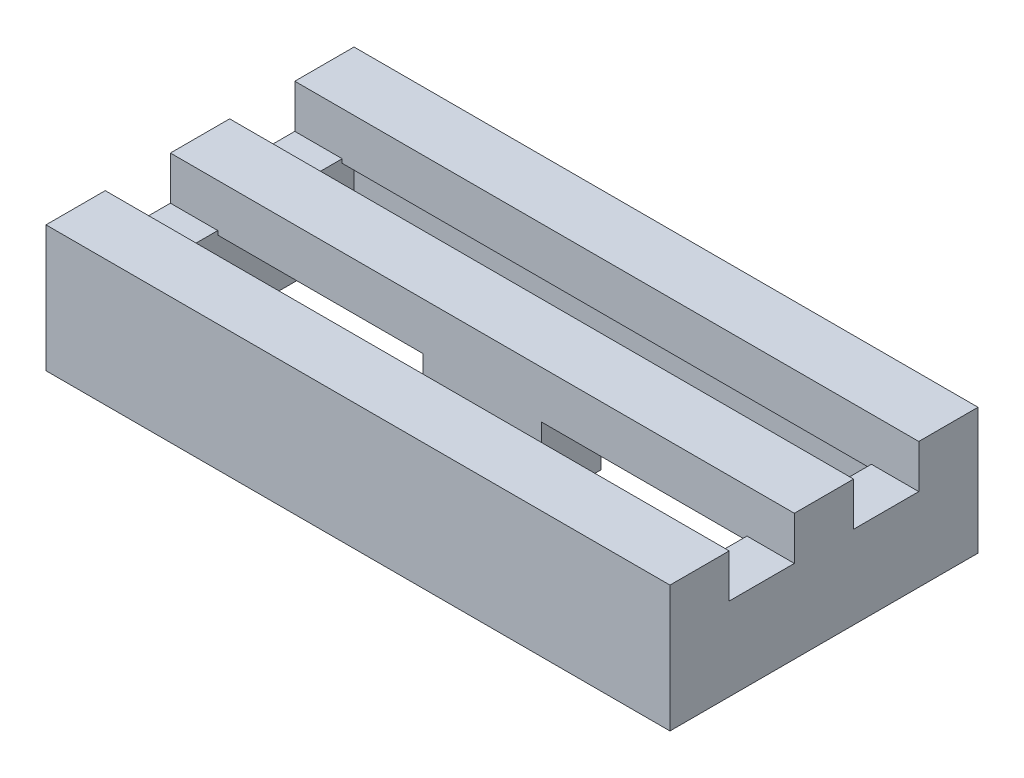
ISO-10303-21;
HEADER;
FILE_DESCRIPTION(('STEP AP214'),'2;1');
FILE_NAME('part.step','',(''),(''),'','','');
FILE_SCHEMA(('AUTOMOTIVE_DESIGN { 1 0 10303 214 1 1 1 1 }'));
ENDSEC;
DATA;
#1=APPLICATION_CONTEXT('core data for automotive mechanical design processes');
#2=APPLICATION_PROTOCOL_DEFINITION('international standard','automotive_design',2000,#1);
#3=PRODUCT_CONTEXT('',#1,'mechanical');
#4=PRODUCT('Part','Part','',(#3));
#5=PRODUCT_RELATED_PRODUCT_CATEGORY('part','',(#4));
#6=PRODUCT_DEFINITION_FORMATION('','',#4);
#7=PRODUCT_DEFINITION_CONTEXT('part definition',#1,'design');
#8=PRODUCT_DEFINITION('design','',#6,#7);
#9=PRODUCT_DEFINITION_SHAPE('','',#8);
#10=(LENGTH_UNIT() NAMED_UNIT(*) SI_UNIT(.MILLI.,.METRE.));
#11=(NAMED_UNIT(*) PLANE_ANGLE_UNIT() SI_UNIT($,.RADIAN.));
#12=(NAMED_UNIT(*) SI_UNIT($,.STERADIAN.) SOLID_ANGLE_UNIT());
#13=UNCERTAINTY_MEASURE_WITH_UNIT(LENGTH_MEASURE(1.E-05),#10,'distance_accuracy_value','');
#14=(GEOMETRIC_REPRESENTATION_CONTEXT(3) GLOBAL_UNCERTAINTY_ASSIGNED_CONTEXT((#13)) GLOBAL_UNIT_ASSIGNED_CONTEXT((#10,
#11,#12)) REPRESENTATION_CONTEXT('',''));
#15=CARTESIAN_POINT('',(0.,0.,0.));
#16=DIRECTION('',(0.,0.,1.));
#17=DIRECTION('',(1.,0.,0.));
#18=AXIS2_PLACEMENT_3D('',#15,#16,#17);
#19=CARTESIAN_POINT('',(0.,2.,-7.8));
#20=DIRECTION('',(0.,1.,0.));
#21=DIRECTION('',(0.,0.,1.));
#22=AXIS2_PLACEMENT_3D('',#19,#20,#21);
#23=PLANE('',#22);
#24=DIRECTION('',(0.,0.,1.));
#25=VECTOR('',#24,1.);
#26=CARTESIAN_POINT('',(9.4,2.,-4.65));
#27=LINE('',#26,#25);
#28=CARTESIAN_POINT('',(9.4,2.,-4.65));
#29=VERTEX_POINT('',#28);
#30=CARTESIAN_POINT('',(9.4,2.,-3.15));
#31=VERTEX_POINT('',#30);
#32=EDGE_CURVE('E54',#29,#31,#27,.T.);
#33=ORIENTED_EDGE('',*,*,#32,.F.);
#34=DIRECTION('',(1.,0.,0.));
#35=VECTOR('',#34,1.);
#36=CARTESIAN_POINT('',(0.,2.,-4.65));
#37=LINE('',#36,#35);
#38=CARTESIAN_POINT('',(14.6,2.,-4.65));
#39=VERTEX_POINT('',#38);
#40=EDGE_CURVE('E296',#29,#39,#37,.T.);
#41=ORIENTED_EDGE('',*,*,#40,.T.);
#42=DIRECTION('',(0.,0.,1.));
#43=VECTOR('',#42,1.);
#44=CARTESIAN_POINT('',(14.6,2.,-7.8));
#45=LINE('',#44,#43);
#46=CARTESIAN_POINT('',(14.6,2.,-3.15));
#47=VERTEX_POINT('',#46);
#48=EDGE_CURVE('E373',#39,#47,#45,.T.);
#49=ORIENTED_EDGE('',*,*,#48,.T.);
#50=DIRECTION('',(-1.,0.,0.));
#51=VECTOR('',#50,1.);
#52=CARTESIAN_POINT('',(0.,2.,-3.15));
#53=LINE('',#52,#51);
#54=EDGE_CURVE('E274',#47,#31,#53,.T.);
#55=ORIENTED_EDGE('',*,*,#54,.T.);
#56=EDGE_LOOP('',(#33,#41,#49,#55));
#57=FACE_BOUND('',#56,.T.);
#58=ADVANCED_FACE('F36',(#57),#23,.F.);
#59=DIRECTION('',(0.,0.,-1.));
#60=VECTOR('',#59,1.);
#61=CARTESIAN_POINT('',(6.4,2.,-3.15));
#62=LINE('',#61,#60);
#63=CARTESIAN_POINT('',(6.4,2.,-3.15));
#64=VERTEX_POINT('',#63);
#65=CARTESIAN_POINT('',(6.4,2.,-4.65));
#66=VERTEX_POINT('',#65);
#67=EDGE_CURVE('E231',#64,#66,#62,.T.);
#68=ORIENTED_EDGE('',*,*,#67,.F.);
#69=CARTESIAN_POINT('',(1.2,2.,-3.15));
#70=VERTEX_POINT('',#69);
#71=EDGE_CURVE('E268',#64,#70,#53,.T.);
#72=ORIENTED_EDGE('',*,*,#71,.T.);
#73=DIRECTION('',(0.,0.,1.));
#74=VECTOR('',#73,1.);
#75=CARTESIAN_POINT('',(1.2,2.,-7.8));
#76=LINE('',#75,#74);
#77=CARTESIAN_POINT('',(1.2,2.,-4.65));
#78=VERTEX_POINT('',#77);
#79=EDGE_CURVE('E360',#78,#70,#76,.T.);
#80=ORIENTED_EDGE('',*,*,#79,.F.);
#81=EDGE_CURVE('E62',#78,#66,#37,.T.);
#82=ORIENTED_EDGE('',*,*,#81,.T.);
#83=EDGE_LOOP('',(#68,#72,#80,#82));
#84=FACE_BOUND('',#83,.T.);
#85=ADVANCED_FACE('F488',(#84),#23,.F.);
#86=CARTESIAN_POINT('',(1.2,2.,-1.5));
#87=VERTEX_POINT('',#86);
#88=CARTESIAN_POINT('',(1.2,2.,-1.2));
#89=VERTEX_POINT('',#88);
#90=EDGE_CURVE('E361',#87,#89,#76,.T.);
#91=ORIENTED_EDGE('',*,*,#90,.F.);
#92=DIRECTION('',(1.,0.,0.));
#93=VECTOR('',#92,1.);
#94=CARTESIAN_POINT('',(0.,2.,-1.5));
#95=LINE('',#94,#93);
#96=CARTESIAN_POINT('',(14.6,2.,-1.5));
#97=VERTEX_POINT('',#96);
#98=EDGE_CURVE('E276',#87,#97,#95,.T.);
#99=ORIENTED_EDGE('',*,*,#98,.T.);
#100=CARTESIAN_POINT('',(14.6,2.,-1.2));
#101=VERTEX_POINT('',#100);
#102=EDGE_CURVE('E374',#97,#101,#45,.T.);
#103=ORIENTED_EDGE('',*,*,#102,.T.);
#104=DIRECTION('',(-1.,0.,0.));
#105=VECTOR('',#104,1.);
#106=CARTESIAN_POINT('',(0.,2.,-1.2));
#107=LINE('',#106,#105);
#108=EDGE_CURVE('E366',#101,#89,#107,.T.);
#109=ORIENTED_EDGE('',*,*,#108,.T.);
#110=EDGE_LOOP('',(#91,#99,#103,#109));
#111=FACE_BOUND('',#110,.T.);
#112=ADVANCED_FACE('F490',(#111),#23,.F.);
#113=CARTESIAN_POINT('',(0.,2.1,3.15));
#114=DIRECTION('',(0.,1.,0.));
#115=DIRECTION('',(0.,0.,1.));
#116=AXIS2_PLACEMENT_3D('',#113,#114,#115);
#117=PLANE('',#116);
#118=DIRECTION('',(0.,0.,1.));
#119=VECTOR('',#118,1.);
#120=CARTESIAN_POINT('',(1.2,2.1,-1.5));
#121=LINE('',#120,#119);
#122=CARTESIAN_POINT('',(1.2,2.1,-3.15));
#123=VERTEX_POINT('',#122);
#124=CARTESIAN_POINT('',(1.2,2.1,-1.5));
#125=VERTEX_POINT('',#124);
#126=EDGE_CURVE('E250',#123,#125,#121,.T.);
#127=ORIENTED_EDGE('',*,*,#126,.F.);
#128=DIRECTION('',(-1.,0.,0.));
#129=VECTOR('',#128,1.);
#130=CARTESIAN_POINT('',(0.,2.1,-3.15));
#131=LINE('',#130,#129);
#132=CARTESIAN_POINT('',(0.,2.1,-3.15));
#133=VERTEX_POINT('',#132);
#134=EDGE_CURVE('E309',#123,#133,#131,.T.);
#135=ORIENTED_EDGE('',*,*,#134,.T.);
#136=DIRECTION('',(0.,0.,1.));
#137=VECTOR('',#136,1.);
#138=CARTESIAN_POINT('',(0.,2.1,-3.15));
#139=LINE('',#138,#137);
#140=CARTESIAN_POINT('',(0.,2.1,-1.5));
#141=VERTEX_POINT('',#140);
#142=EDGE_CURVE('E299',#133,#141,#139,.T.);
#143=ORIENTED_EDGE('',*,*,#142,.T.);
#144=DIRECTION('',(1.,0.,0.));
#145=VECTOR('',#144,1.);
#146=CARTESIAN_POINT('',(0.,2.1,-1.5));
#147=LINE('',#146,#145);
#148=EDGE_CURVE('E304',#141,#125,#147,.T.);
#149=ORIENTED_EDGE('',*,*,#148,.T.);
#150=EDGE_LOOP('',(#127,#135,#143,#149));
#151=FACE_BOUND('',#150,.T.);
#152=ADVANCED_FACE('F483',(#151),#117,.T.);
#153=CARTESIAN_POINT('',(0.,2.1,0.));
#154=DIRECTION('',(0.,1.,0.));
#155=DIRECTION('',(0.,0.,1.));
#156=AXIS2_PLACEMENT_3D('',#153,#154,#155);
#157=PLANE('',#156);
#158=DIRECTION('',(0.,0.,1.));
#159=VECTOR('',#158,1.);
#160=CARTESIAN_POINT('',(1.2,2.1,-4.65));
#161=LINE('',#160,#159);
#162=CARTESIAN_POINT('',(1.2,2.1,-6.3));
#163=VERTEX_POINT('',#162);
#164=CARTESIAN_POINT('',(1.2,2.1,-4.65));
#165=VERTEX_POINT('',#164);
#166=EDGE_CURVE('E282',#163,#165,#161,.T.);
#167=ORIENTED_EDGE('',*,*,#166,.F.);
#168=DIRECTION('',(-1.,0.,0.));
#169=VECTOR('',#168,1.);
#170=CARTESIAN_POINT('',(0.,2.1,-6.3));
#171=LINE('',#170,#169);
#172=CARTESIAN_POINT('',(0.,2.1,-6.3));
#173=VERTEX_POINT('',#172);
#174=EDGE_CURVE('E336',#163,#173,#171,.T.);
#175=ORIENTED_EDGE('',*,*,#174,.T.);
#176=DIRECTION('',(0.,0.,1.));
#177=VECTOR('',#176,1.);
#178=CARTESIAN_POINT('',(0.,2.1,-6.3));
#179=LINE('',#178,#177);
#180=CARTESIAN_POINT('',(0.,2.1,-4.65));
#181=VERTEX_POINT('',#180);
#182=EDGE_CURVE('E326',#173,#181,#179,.T.);
#183=ORIENTED_EDGE('',*,*,#182,.T.);
#184=DIRECTION('',(1.,0.,0.));
#185=VECTOR('',#184,1.);
#186=CARTESIAN_POINT('',(0.,2.1,-4.65));
#187=LINE('',#186,#185);
#188=EDGE_CURVE('E331',#181,#165,#187,.T.);
#189=ORIENTED_EDGE('',*,*,#188,.T.);
#190=EDGE_LOOP('',(#167,#175,#183,#189));
#191=FACE_BOUND('',#190,.T.);
#192=ADVANCED_FACE('F465',(#191),#157,.T.);
#193=CARTESIAN_POINT('',(0.,3.2,-7.8));
#194=DIRECTION('',(0.,1.,0.));
#195=DIRECTION('',(0.,0.,1.));
#196=AXIS2_PLACEMENT_3D('',#193,#194,#195);
#197=PLANE('',#196);
#198=DIRECTION('',(-1.,0.,0.));
#199=VECTOR('',#198,1.);
#200=CARTESIAN_POINT('',(0.,3.2,-3.15));
#201=LINE('',#200,#199);
#202=CARTESIAN_POINT('',(15.8,3.2,-3.15));
#203=VERTEX_POINT('',#202);
#204=CARTESIAN_POINT('',(0.,3.2,-3.15));
#205=VERTEX_POINT('',#204);
#206=EDGE_CURVE('E303',#203,#205,#201,.T.);
#207=ORIENTED_EDGE('',*,*,#206,.F.);
#208=DIRECTION('',(0.,0.,1.));
#209=VECTOR('',#208,1.);
#210=CARTESIAN_POINT('',(15.8,3.2,-7.8));
#211=LINE('',#210,#209);
#212=CARTESIAN_POINT('',(15.8,3.2,-4.65));
#213=VERTEX_POINT('',#212);
#214=EDGE_CURVE('E415',#213,#203,#211,.T.);
#215=ORIENTED_EDGE('',*,*,#214,.F.);
#216=DIRECTION('',(1.,0.,0.));
#217=VECTOR('',#216,1.);
#218=CARTESIAN_POINT('',(0.,3.2,-4.65));
#219=LINE('',#218,#217);
#220=CARTESIAN_POINT('',(0.,3.2,-4.65));
#221=VERTEX_POINT('',#220);
#222=EDGE_CURVE('E319',#221,#213,#219,.T.);
#223=ORIENTED_EDGE('',*,*,#222,.F.);
#224=DIRECTION('',(0.,0.,1.));
#225=VECTOR('',#224,1.);
#226=CARTESIAN_POINT('',(0.,3.2,-7.8));
#227=LINE('',#226,#225);
#228=EDGE_CURVE('E45',#221,#205,#227,.T.);
#229=ORIENTED_EDGE('',*,*,#228,.T.);
#230=EDGE_LOOP('',(#207,#215,#223,#229));
#231=FACE_BOUND('',#230,.T.);
#232=ADVANCED_FACE('F441',(#231),#197,.T.);
#233=DIRECTION('',(-1.,0.,0.));
#234=VECTOR('',#233,1.);
#235=CARTESIAN_POINT('',(0.,3.2,-6.3));
#236=LINE('',#235,#234);
#237=CARTESIAN_POINT('',(15.8,3.2,-6.3));
#238=VERTEX_POINT('',#237);
#239=CARTESIAN_POINT('',(0.,3.2,-6.3));
#240=VERTEX_POINT('',#239);
#241=EDGE_CURVE('E330',#238,#240,#236,.T.);
#242=ORIENTED_EDGE('',*,*,#241,.F.);
#243=CARTESIAN_POINT('',(15.8,3.2,-7.8));
#244=VERTEX_POINT('',#243);
#245=EDGE_CURVE('E413',#244,#238,#211,.T.);
#246=ORIENTED_EDGE('',*,*,#245,.F.);
#247=DIRECTION('',(-1.,0.,0.));
#248=VECTOR('',#247,1.);
#249=CARTESIAN_POINT('',(0.,3.2,-7.8));
#250=LINE('',#249,#248);
#251=CARTESIAN_POINT('',(0.,3.2,-7.8));
#252=VERTEX_POINT('',#251);
#253=EDGE_CURVE('E400',#244,#252,#250,.T.);
#254=ORIENTED_EDGE('',*,*,#253,.T.);
#255=EDGE_CURVE('E12',#252,#240,#227,.T.);
#256=ORIENTED_EDGE('',*,*,#255,.T.);
#257=EDGE_LOOP('',(#242,#246,#254,#256));
#258=FACE_BOUND('',#257,.T.);
#259=ADVANCED_FACE('F471',(#258),#197,.T.);
#260=CARTESIAN_POINT('',(0.,0.,-7.8));
#261=DIRECTION('',(0.,-1.,0.));
#262=DIRECTION('',(0.,0.,-1.));
#263=AXIS2_PLACEMENT_3D('',#260,#261,#262);
#264=PLANE('',#263);
#265=DIRECTION('',(1.,0.,0.));
#266=VECTOR('',#265,1.);
#267=CARTESIAN_POINT('',(0.,0.,0.));
#268=LINE('',#267,#266);
#269=CARTESIAN_POINT('',(0.,0.,0.));
#270=VERTEX_POINT('',#269);
#271=CARTESIAN_POINT('',(15.8,0.,0.));
#272=VERTEX_POINT('',#271);
#273=EDGE_CURVE('E405',#270,#272,#268,.T.);
#274=ORIENTED_EDGE('',*,*,#273,.F.);
#275=DIRECTION('',(0.,0.,1.));
#276=VECTOR('',#275,1.);
#277=CARTESIAN_POINT('',(0.,0.,-7.8));
#278=LINE('',#277,#276);
#279=CARTESIAN_POINT('',(0.,0.,-7.8));
#280=VERTEX_POINT('',#279);
#281=EDGE_CURVE('E40',#280,#270,#278,.T.);
#282=ORIENTED_EDGE('',*,*,#281,.F.);
#283=DIRECTION('',(1.,0.,0.));
#284=VECTOR('',#283,1.);
#285=CARTESIAN_POINT('',(0.,0.,-7.8));
#286=LINE('',#285,#284);
#287=CARTESIAN_POINT('',(15.8,0.,-7.8));
#288=VERTEX_POINT('',#287);
#289=EDGE_CURVE('E393',#280,#288,#286,.T.);
#290=ORIENTED_EDGE('',*,*,#289,.T.);
#291=DIRECTION('',(0.,0.,1.));
#292=VECTOR('',#291,1.);
#293=CARTESIAN_POINT('',(15.8,0.,-7.8));
#294=LINE('',#293,#292);
#295=EDGE_CURVE('E417',#288,#272,#294,.T.);
#296=ORIENTED_EDGE('',*,*,#295,.T.);
#297=EDGE_LOOP('',(#274,#282,#290,#296));
#298=FACE_BOUND('',#297,.T.);
#299=DIRECTION('',(0.,0.,1.));
#300=VECTOR('',#299,1.);
#301=CARTESIAN_POINT('',(1.2,0.,-7.8));
#302=LINE('',#301,#300);
#303=CARTESIAN_POINT('',(1.2,0.,-6.6));
#304=VERTEX_POINT('',#303);
#305=CARTESIAN_POINT('',(1.2,0.,-1.2));
#306=VERTEX_POINT('',#305);
#307=EDGE_CURVE('E378',#304,#306,#302,.T.);
#308=ORIENTED_EDGE('',*,*,#307,.T.);
#309=DIRECTION('',(1.,0.,0.));
#310=VECTOR('',#309,1.);
#311=CARTESIAN_POINT('',(0.,0.,-1.2));
#312=LINE('',#311,#310);
#313=CARTESIAN_POINT('',(14.6,0.,-1.2));
#314=VERTEX_POINT('',#313);
#315=EDGE_CURVE('E355',#306,#314,#312,.T.);
#316=ORIENTED_EDGE('',*,*,#315,.T.);
#317=DIRECTION('',(0.,0.,1.));
#318=VECTOR('',#317,1.);
#319=CARTESIAN_POINT('',(14.6,0.,-7.8));
#320=LINE('',#319,#318);
#321=CARTESIAN_POINT('',(14.6,0.,-6.6));
#322=VERTEX_POINT('',#321);
#323=EDGE_CURVE('E385',#322,#314,#320,.T.);
#324=ORIENTED_EDGE('',*,*,#323,.F.);
#325=DIRECTION('',(1.,0.,0.));
#326=VECTOR('',#325,1.);
#327=CARTESIAN_POINT('',(0.,0.,-6.6));
#328=LINE('',#327,#326);
#329=EDGE_CURVE('E365',#304,#322,#328,.T.);
#330=ORIENTED_EDGE('',*,*,#329,.F.);
#331=EDGE_LOOP('',(#308,#316,#324,#330));
#332=FACE_BOUND('',#331,.T.);
#333=ADVANCED_FACE('F426',(#298,#332),#264,.T.);
#334=CARTESIAN_POINT('',(0.,0.,-7.8));
#335=DIRECTION('',(-1.,0.,0.));
#336=DIRECTION('',(0.,0.,1.));
#337=AXIS2_PLACEMENT_3D('',#334,#335,#336);
#338=PLANE('',#337);
#339=DIRECTION('',(0.,1.,0.));
#340=VECTOR('',#339,1.);
#341=CARTESIAN_POINT('',(0.,2.1,-3.15));
#342=LINE('',#341,#340);
#343=EDGE_CURVE('E316',#133,#205,#342,.T.);
#344=ORIENTED_EDGE('',*,*,#343,.T.);
#345=ORIENTED_EDGE('',*,*,#228,.F.);
#346=DIRECTION('',(0.,1.,0.));
#347=VECTOR('',#346,1.);
#348=CARTESIAN_POINT('',(0.,2.1,-4.65));
#349=LINE('',#348,#347);
#350=EDGE_CURVE('E340',#181,#221,#349,.T.);
#351=ORIENTED_EDGE('',*,*,#350,.F.);
#352=ORIENTED_EDGE('',*,*,#182,.F.);
#353=DIRECTION('',(0.,1.,0.));
#354=VECTOR('',#353,1.);
#355=CARTESIAN_POINT('',(0.,2.1,-6.3));
#356=LINE('',#355,#354);
#357=EDGE_CURVE('E343',#173,#240,#356,.T.);
#358=ORIENTED_EDGE('',*,*,#357,.T.);
#359=ORIENTED_EDGE('',*,*,#255,.F.);
#360=DIRECTION('',(0.,-1.,0.));
#361=VECTOR('',#360,1.);
#362=CARTESIAN_POINT('',(0.,0.,-7.8));
#363=LINE('',#362,#361);
#364=EDGE_CURVE('E390',#252,#280,#363,.T.);
#365=ORIENTED_EDGE('',*,*,#364,.T.);
#366=ORIENTED_EDGE('',*,*,#281,.T.);
#367=DIRECTION('',(0.,-1.,0.));
#368=VECTOR('',#367,1.);
#369=CARTESIAN_POINT('',(0.,0.,0.));
#370=LINE('',#369,#368);
#371=CARTESIAN_POINT('',(0.,3.2,0.));
#372=VERTEX_POINT('',#371);
#373=EDGE_CURVE('E359',#372,#270,#370,.T.);
#374=ORIENTED_EDGE('',*,*,#373,.F.);
#375=CARTESIAN_POINT('',(0.,3.2,-1.5));
#376=VERTEX_POINT('',#375);
#377=EDGE_CURVE('E47',#376,#372,#227,.T.);
#378=ORIENTED_EDGE('',*,*,#377,.F.);
#379=DIRECTION('',(0.,1.,0.));
#380=VECTOR('',#379,1.);
#381=CARTESIAN_POINT('',(0.,2.1,-1.5));
#382=LINE('',#381,#380);
#383=EDGE_CURVE('E313',#141,#376,#382,.T.);
#384=ORIENTED_EDGE('',*,*,#383,.F.);
#385=ORIENTED_EDGE('',*,*,#142,.F.);
#386=EDGE_LOOP('',(#344,#345,#351,#352,#358,#359,#365,#366,#374,#378,#384,#385));
#387=FACE_BOUND('',#386,.T.);
#388=ADVANCED_FACE('F38',(#387),#338,.T.);
#389=DIRECTION('',(1.,0.,0.));
#390=VECTOR('',#389,1.);
#391=CARTESIAN_POINT('',(0.,3.2,-1.5));
#392=LINE('',#391,#390);
#393=CARTESIAN_POINT('',(15.8,3.2,-1.5));
#394=VERTEX_POINT('',#393);
#395=EDGE_CURVE('E298',#376,#394,#392,.T.);
#396=ORIENTED_EDGE('',*,*,#395,.F.);
#397=ORIENTED_EDGE('',*,*,#377,.T.);
#398=DIRECTION('',(-1.,0.,0.));
#399=VECTOR('',#398,1.);
#400=CARTESIAN_POINT('',(0.,3.2,0.));
#401=LINE('',#400,#399);
#402=CARTESIAN_POINT('',(15.8,3.2,0.));
#403=VERTEX_POINT('',#402);
#404=EDGE_CURVE('E394',#403,#372,#401,.T.);
#405=ORIENTED_EDGE('',*,*,#404,.F.);
#406=EDGE_CURVE('E416',#394,#403,#211,.T.);
#407=ORIENTED_EDGE('',*,*,#406,.F.);
#408=EDGE_LOOP('',(#396,#397,#405,#407));
#409=FACE_BOUND('',#408,.T.);
#410=ADVANCED_FACE('F434',(#409),#197,.T.);
#411=CARTESIAN_POINT('',(15.8,0.,-7.8));
#412=DIRECTION('',(1.,0.,0.));
#413=DIRECTION('',(0.,0.,-1.));
#414=AXIS2_PLACEMENT_3D('',#411,#412,#413);
#415=PLANE('',#414);
#416=DIRECTION('',(0.,1.,0.));
#417=VECTOR('',#416,1.);
#418=CARTESIAN_POINT('',(15.8,2.1,-3.15));
#419=LINE('',#418,#417);
#420=CARTESIAN_POINT('',(15.8,2.1,-3.15));
#421=VERTEX_POINT('',#420);
#422=EDGE_CURVE('E320',#421,#203,#419,.T.);
#423=ORIENTED_EDGE('',*,*,#422,.F.);
#424=DIRECTION('',(0.,0.,-1.));
#425=VECTOR('',#424,1.);
#426=CARTESIAN_POINT('',(15.8,2.1,-1.5));
#427=LINE('',#426,#425);
#428=CARTESIAN_POINT('',(15.8,2.1,-1.5));
#429=VERTEX_POINT('',#428);
#430=EDGE_CURVE('E307',#429,#421,#427,.T.);
#431=ORIENTED_EDGE('',*,*,#430,.F.);
#432=DIRECTION('',(0.,1.,0.));
#433=VECTOR('',#432,1.);
#434=CARTESIAN_POINT('',(15.8,2.1,-1.5));
#435=LINE('',#434,#433);
#436=EDGE_CURVE('E322',#429,#394,#435,.T.);
#437=ORIENTED_EDGE('',*,*,#436,.T.);
#438=ORIENTED_EDGE('',*,*,#406,.T.);
#439=DIRECTION('',(0.,1.,0.));
#440=VECTOR('',#439,1.);
#441=CARTESIAN_POINT('',(15.8,0.,0.));
#442=LINE('',#441,#440);
#443=EDGE_CURVE('E408',#272,#403,#442,.T.);
#444=ORIENTED_EDGE('',*,*,#443,.F.);
#445=ORIENTED_EDGE('',*,*,#295,.F.);
#446=DIRECTION('',(0.,1.,0.));
#447=VECTOR('',#446,1.);
#448=CARTESIAN_POINT('',(15.8,0.,-7.8));
#449=LINE('',#448,#447);
#450=EDGE_CURVE('E397',#288,#244,#449,.T.);
#451=ORIENTED_EDGE('',*,*,#450,.T.);
#452=ORIENTED_EDGE('',*,*,#245,.T.);
#453=DIRECTION('',(0.,1.,0.));
#454=VECTOR('',#453,1.);
#455=CARTESIAN_POINT('',(15.8,2.1,-6.3));
#456=LINE('',#455,#454);
#457=CARTESIAN_POINT('',(15.8,2.1,-6.3));
#458=VERTEX_POINT('',#457);
#459=EDGE_CURVE('E347',#458,#238,#456,.T.);
#460=ORIENTED_EDGE('',*,*,#459,.F.);
#461=DIRECTION('',(0.,0.,-1.));
#462=VECTOR('',#461,1.);
#463=CARTESIAN_POINT('',(15.8,2.1,-4.65));
#464=LINE('',#463,#462);
#465=CARTESIAN_POINT('',(15.8,2.1,-4.65));
#466=VERTEX_POINT('',#465);
#467=EDGE_CURVE('E334',#466,#458,#464,.T.);
#468=ORIENTED_EDGE('',*,*,#467,.F.);
#469=DIRECTION('',(0.,1.,0.));
#470=VECTOR('',#469,1.);
#471=CARTESIAN_POINT('',(15.8,2.1,-4.65));
#472=LINE('',#471,#470);
#473=EDGE_CURVE('E349',#466,#213,#472,.T.);
#474=ORIENTED_EDGE('',*,*,#473,.T.);
#475=ORIENTED_EDGE('',*,*,#214,.T.);
#476=EDGE_LOOP('',(#423,#431,#437,#438,#444,#445,#451,#452,#460,#468,#474,#475));
#477=FACE_BOUND('',#476,.T.);
#478=ADVANCED_FACE('F456',(#477),#415,.T.);
#479=CARTESIAN_POINT('',(0.,0.,-7.8));
#480=DIRECTION('',(0.,0.,-1.));
#481=DIRECTION('',(-1.,0.,0.));
#482=AXIS2_PLACEMENT_3D('',#479,#480,#481);
#483=PLANE('',#482);
#484=ORIENTED_EDGE('',*,*,#364,.F.);
#485=ORIENTED_EDGE('',*,*,#253,.F.);
#486=ORIENTED_EDGE('',*,*,#450,.F.);
#487=ORIENTED_EDGE('',*,*,#289,.F.);
#488=EDGE_LOOP('',(#484,#485,#486,#487));
#489=FACE_BOUND('',#488,.T.);
#490=ADVANCED_FACE('F475',(#489),#483,.T.);
#491=CARTESIAN_POINT('',(0.,0.,0.));
#492=DIRECTION('',(0.,0.,-1.));
#493=DIRECTION('',(-1.,0.,0.));
#494=AXIS2_PLACEMENT_3D('',#491,#492,#493);
#495=PLANE('',#494);
#496=ORIENTED_EDGE('',*,*,#373,.T.);
#497=ORIENTED_EDGE('',*,*,#273,.T.);
#498=ORIENTED_EDGE('',*,*,#443,.T.);
#499=ORIENTED_EDGE('',*,*,#404,.T.);
#500=EDGE_LOOP('',(#496,#497,#498,#499));
#501=FACE_BOUND('',#500,.T.);
#502=ADVANCED_FACE('F429',(#501),#495,.F.);
#503=CARTESIAN_POINT('',(1.2,0.,-7.8));
#504=DIRECTION('',(-1.,0.,0.));
#505=DIRECTION('',(0.,0.,1.));
#506=AXIS2_PLACEMENT_3D('',#503,#504,#505);
#507=PLANE('',#506);
#508=ORIENTED_EDGE('',*,*,#79,.T.);
#509=DIRECTION('',(0.,1.,0.));
#510=VECTOR('',#509,1.);
#511=CARTESIAN_POINT('',(1.2,0.,-3.15));
#512=LINE('',#511,#510);
#513=EDGE_CURVE('E269',#70,#123,#512,.T.);
#514=ORIENTED_EDGE('',*,*,#513,.T.);
#515=ORIENTED_EDGE('',*,*,#126,.T.);
#516=DIRECTION('',(0.,1.,0.));
#517=VECTOR('',#516,1.);
#518=CARTESIAN_POINT('',(1.2,0.,-1.5));
#519=LINE('',#518,#517);
#520=EDGE_CURVE('E266',#87,#125,#519,.T.);
#521=ORIENTED_EDGE('',*,*,#520,.F.);
#522=ORIENTED_EDGE('',*,*,#90,.T.);
#523=DIRECTION('',(0.,-1.,0.));
#524=VECTOR('',#523,1.);
#525=CARTESIAN_POINT('',(1.2,0.,-1.2));
#526=LINE('',#525,#524);
#527=EDGE_CURVE('E346',#89,#306,#526,.T.);
#528=ORIENTED_EDGE('',*,*,#527,.T.);
#529=ORIENTED_EDGE('',*,*,#307,.F.);
#530=DIRECTION('',(0.,-1.,0.));
#531=VECTOR('',#530,1.);
#532=CARTESIAN_POINT('',(1.2,0.,-6.6));
#533=LINE('',#532,#531);
#534=CARTESIAN_POINT('',(1.2,2.,-6.6));
#535=VERTEX_POINT('',#534);
#536=EDGE_CURVE('E362',#535,#304,#533,.T.);
#537=ORIENTED_EDGE('',*,*,#536,.F.);
#538=CARTESIAN_POINT('',(1.2,2.,-6.3));
#539=VERTEX_POINT('',#538);
#540=EDGE_CURVE('E356',#535,#539,#76,.T.);
#541=ORIENTED_EDGE('',*,*,#540,.T.);
#542=DIRECTION('',(0.,1.,0.));
#543=VECTOR('',#542,1.);
#544=CARTESIAN_POINT('',(1.2,0.,-6.3));
#545=LINE('',#544,#543);
#546=EDGE_CURVE('E289',#539,#163,#545,.T.);
#547=ORIENTED_EDGE('',*,*,#546,.T.);
#548=ORIENTED_EDGE('',*,*,#166,.T.);
#549=DIRECTION('',(0.,1.,0.));
#550=VECTOR('',#549,1.);
#551=CARTESIAN_POINT('',(1.2,0.,-4.65));
#552=LINE('',#551,#550);
#553=EDGE_CURVE('E286',#78,#165,#552,.T.);
#554=ORIENTED_EDGE('',*,*,#553,.F.);
#555=EDGE_LOOP('',(#508,#514,#515,#521,#522,#528,#529,#537,#541,#547,#548,#554));
#556=FACE_BOUND('',#555,.T.);
#557=ADVANCED_FACE('F486',(#556),#507,.F.);
#558=CARTESIAN_POINT('',(14.6,2.,-6.6));
#559=VERTEX_POINT('',#558);
#560=CARTESIAN_POINT('',(14.6,2.,-6.3));
#561=VERTEX_POINT('',#560);
#562=EDGE_CURVE('E370',#559,#561,#45,.T.);
#563=ORIENTED_EDGE('',*,*,#562,.T.);
#564=DIRECTION('',(-1.,0.,0.));
#565=VECTOR('',#564,1.);
#566=CARTESIAN_POINT('',(0.,2.,-6.3));
#567=LINE('',#566,#565);
#568=EDGE_CURVE('E288',#561,#539,#567,.T.);
#569=ORIENTED_EDGE('',*,*,#568,.T.);
#570=ORIENTED_EDGE('',*,*,#540,.F.);
#571=DIRECTION('',(-1.,0.,0.));
#572=VECTOR('',#571,1.);
#573=CARTESIAN_POINT('',(0.,2.,-6.6));
#574=LINE('',#573,#572);
#575=EDGE_CURVE('E375',#559,#535,#574,.T.);
#576=ORIENTED_EDGE('',*,*,#575,.F.);
#577=EDGE_LOOP('',(#563,#569,#570,#576));
#578=FACE_BOUND('',#577,.T.);
#579=ADVANCED_FACE('F497',(#578),#23,.F.);
#580=CARTESIAN_POINT('',(14.6,0.,-7.8));
#581=DIRECTION('',(1.,0.,0.));
#582=DIRECTION('',(0.,0.,-1.));
#583=AXIS2_PLACEMENT_3D('',#580,#581,#582);
#584=PLANE('',#583);
#585=ORIENTED_EDGE('',*,*,#323,.T.);
#586=DIRECTION('',(0.,1.,0.));
#587=VECTOR('',#586,1.);
#588=CARTESIAN_POINT('',(14.6,0.,-1.2));
#589=LINE('',#588,#587);
#590=EDGE_CURVE('E369',#314,#101,#589,.T.);
#591=ORIENTED_EDGE('',*,*,#590,.T.);
#592=ORIENTED_EDGE('',*,*,#102,.F.);
#593=DIRECTION('',(0.,1.,0.));
#594=VECTOR('',#593,1.);
#595=CARTESIAN_POINT('',(14.6,0.,-1.5));
#596=LINE('',#595,#594);
#597=CARTESIAN_POINT('',(14.6,2.1,-1.5));
#598=VERTEX_POINT('',#597);
#599=EDGE_CURVE('E265',#97,#598,#596,.T.);
#600=ORIENTED_EDGE('',*,*,#599,.T.);
#601=DIRECTION('',(0.,0.,-1.));
#602=VECTOR('',#601,1.);
#603=CARTESIAN_POINT('',(14.6,2.1,-1.5));
#604=LINE('',#603,#602);
#605=CARTESIAN_POINT('',(14.6,2.1,-3.15));
#606=VERTEX_POINT('',#605);
#607=EDGE_CURVE('E247',#598,#606,#604,.T.);
#608=ORIENTED_EDGE('',*,*,#607,.T.);
#609=DIRECTION('',(0.,1.,0.));
#610=VECTOR('',#609,1.);
#611=CARTESIAN_POINT('',(14.6,0.,-3.15));
#612=LINE('',#611,#610);
#613=EDGE_CURVE('E271',#47,#606,#612,.T.);
#614=ORIENTED_EDGE('',*,*,#613,.F.);
#615=ORIENTED_EDGE('',*,*,#48,.F.);
#616=DIRECTION('',(0.,1.,0.));
#617=VECTOR('',#616,1.);
#618=CARTESIAN_POINT('',(14.6,0.,-4.65));
#619=LINE('',#618,#617);
#620=CARTESIAN_POINT('',(14.6,2.1,-4.65));
#621=VERTEX_POINT('',#620);
#622=EDGE_CURVE('E285',#39,#621,#619,.T.);
#623=ORIENTED_EDGE('',*,*,#622,.T.);
#624=DIRECTION('',(0.,0.,-1.));
#625=VECTOR('',#624,1.);
#626=CARTESIAN_POINT('',(14.6,2.1,-4.65));
#627=LINE('',#626,#625);
#628=CARTESIAN_POINT('',(14.6,2.1,-6.3));
#629=VERTEX_POINT('',#628);
#630=EDGE_CURVE('E279',#621,#629,#627,.T.);
#631=ORIENTED_EDGE('',*,*,#630,.T.);
#632=DIRECTION('',(0.,1.,0.));
#633=VECTOR('',#632,1.);
#634=CARTESIAN_POINT('',(14.6,0.,-6.3));
#635=LINE('',#634,#633);
#636=EDGE_CURVE('E291',#561,#629,#635,.T.);
#637=ORIENTED_EDGE('',*,*,#636,.F.);
#638=ORIENTED_EDGE('',*,*,#562,.F.);
#639=DIRECTION('',(0.,1.,0.));
#640=VECTOR('',#639,1.);
#641=CARTESIAN_POINT('',(14.6,0.,-6.6));
#642=LINE('',#641,#640);
#643=EDGE_CURVE('E379',#322,#559,#642,.T.);
#644=ORIENTED_EDGE('',*,*,#643,.F.);
#645=EDGE_LOOP('',(#585,#591,#592,#600,#608,#614,#615,#623,#631,#637,#638,#644));
#646=FACE_BOUND('',#645,.T.);
#647=ADVANCED_FACE('F501',(#646),#584,.F.);
#648=CARTESIAN_POINT('',(0.,0.,-6.6));
#649=DIRECTION('',(0.,0.,-1.));
#650=DIRECTION('',(-1.,0.,0.));
#651=AXIS2_PLACEMENT_3D('',#648,#649,#650);
#652=PLANE('',#651);
#653=ORIENTED_EDGE('',*,*,#536,.T.);
#654=ORIENTED_EDGE('',*,*,#329,.T.);
#655=ORIENTED_EDGE('',*,*,#643,.T.);
#656=ORIENTED_EDGE('',*,*,#575,.T.);
#657=EDGE_LOOP('',(#653,#654,#655,#656));
#658=FACE_BOUND('',#657,.T.);
#659=ADVANCED_FACE('F506',(#658),#652,.F.);
#660=CARTESIAN_POINT('',(0.,0.,-1.2));
#661=DIRECTION('',(0.,0.,-1.));
#662=DIRECTION('',(-1.,0.,0.));
#663=AXIS2_PLACEMENT_3D('',#660,#661,#662);
#664=PLANE('',#663);
#665=ORIENTED_EDGE('',*,*,#527,.F.);
#666=ORIENTED_EDGE('',*,*,#108,.F.);
#667=ORIENTED_EDGE('',*,*,#590,.F.);
#668=ORIENTED_EDGE('',*,*,#315,.F.);
#669=EDGE_LOOP('',(#665,#666,#667,#668));
#670=FACE_BOUND('',#669,.T.);
#671=ADVANCED_FACE('F510',(#670),#664,.T.);
#672=CARTESIAN_POINT('',(0.,2.1,-6.3));
#673=DIRECTION('',(0.,0.,-1.));
#674=DIRECTION('',(-1.,0.,0.));
#675=AXIS2_PLACEMENT_3D('',#672,#673,#674);
#676=PLANE('',#675);
#677=ORIENTED_EDGE('',*,*,#241,.T.);
#678=ORIENTED_EDGE('',*,*,#357,.F.);
#679=ORIENTED_EDGE('',*,*,#174,.F.);
#680=ORIENTED_EDGE('',*,*,#546,.F.);
#681=ORIENTED_EDGE('',*,*,#568,.F.);
#682=ORIENTED_EDGE('',*,*,#636,.T.);
#683=EDGE_CURVE('E337',#458,#629,#171,.T.);
#684=ORIENTED_EDGE('',*,*,#683,.F.);
#685=ORIENTED_EDGE('',*,*,#459,.T.);
#686=EDGE_LOOP('',(#677,#678,#679,#680,#681,#682,#684,#685));
#687=FACE_BOUND('',#686,.T.);
#688=ADVANCED_FACE('F514',(#687),#676,.F.);
#689=CARTESIAN_POINT('',(0.,2.1,-4.65));
#690=DIRECTION('',(0.,0.,1.));
#691=DIRECTION('',(1.,0.,0.));
#692=AXIS2_PLACEMENT_3D('',#689,#690,#691);
#693=PLANE('',#692);
#694=ORIENTED_EDGE('',*,*,#222,.T.);
#695=ORIENTED_EDGE('',*,*,#473,.F.);
#696=EDGE_CURVE('E329',#621,#466,#187,.T.);
#697=ORIENTED_EDGE('',*,*,#696,.F.);
#698=ORIENTED_EDGE('',*,*,#622,.F.);
#699=ORIENTED_EDGE('',*,*,#40,.F.);
#700=DIRECTION('',(0.,1.,0.));
#701=VECTOR('',#700,1.);
#702=CARTESIAN_POINT('',(9.4,-3.35410196624968,-4.65));
#703=LINE('',#702,#701);
#704=CARTESIAN_POINT('',(9.4,0.2,-4.65));
#705=VERTEX_POINT('',#704);
#706=EDGE_CURVE('E238',#705,#29,#703,.T.);
#707=ORIENTED_EDGE('',*,*,#706,.F.);
#708=DIRECTION('',(1.,0.,0.));
#709=VECTOR('',#708,1.);
#710=CARTESIAN_POINT('',(6.4,0.2,-4.65));
#711=LINE('',#710,#709);
#712=CARTESIAN_POINT('',(6.4,0.199999999999999,-4.65));
#713=VERTEX_POINT('',#712);
#714=EDGE_CURVE('E233',#713,#705,#711,.T.);
#715=ORIENTED_EDGE('',*,*,#714,.F.);
#716=DIRECTION('',(0.,1.,0.));
#717=VECTOR('',#716,1.);
#718=CARTESIAN_POINT('',(6.4,-3.35410196624968,-4.65));
#719=LINE('',#718,#717);
#720=EDGE_CURVE('E224',#713,#66,#719,.T.);
#721=ORIENTED_EDGE('',*,*,#720,.T.);
#722=ORIENTED_EDGE('',*,*,#81,.F.);
#723=ORIENTED_EDGE('',*,*,#553,.T.);
#724=ORIENTED_EDGE('',*,*,#188,.F.);
#725=ORIENTED_EDGE('',*,*,#350,.T.);
#726=EDGE_LOOP('',(#694,#695,#697,#698,#699,#707,#715,#721,#722,#723,#724,#725));
#727=FACE_BOUND('',#726,.T.);
#728=ADVANCED_FACE('F236',(#727),#693,.F.);
#729=ORIENTED_EDGE('',*,*,#630,.F.);
#730=ORIENTED_EDGE('',*,*,#696,.T.);
#731=ORIENTED_EDGE('',*,*,#467,.T.);
#732=ORIENTED_EDGE('',*,*,#683,.T.);
#733=EDGE_LOOP('',(#729,#730,#731,#732));
#734=FACE_BOUND('',#733,.T.);
#735=ADVANCED_FACE('F535',(#734),#157,.T.);
#736=CARTESIAN_POINT('',(0.,2.1,-3.15));
#737=DIRECTION('',(0.,0.,-1.));
#738=DIRECTION('',(-1.,0.,0.));
#739=AXIS2_PLACEMENT_3D('',#736,#737,#738);
#740=PLANE('',#739);
#741=ORIENTED_EDGE('',*,*,#206,.T.);
#742=ORIENTED_EDGE('',*,*,#343,.F.);
#743=ORIENTED_EDGE('',*,*,#134,.F.);
#744=ORIENTED_EDGE('',*,*,#513,.F.);
#745=ORIENTED_EDGE('',*,*,#71,.F.);
#746=DIRECTION('',(0.,1.,0.));
#747=VECTOR('',#746,1.);
#748=CARTESIAN_POINT('',(6.4,-3.35410196624968,-3.15));
#749=LINE('',#748,#747);
#750=CARTESIAN_POINT('',(6.4,0.199999999999999,-3.15));
#751=VERTEX_POINT('',#750);
#752=EDGE_CURVE('E260',#751,#64,#749,.T.);
#753=ORIENTED_EDGE('',*,*,#752,.F.);
#754=DIRECTION('',(-1.,0.,0.));
#755=VECTOR('',#754,1.);
#756=CARTESIAN_POINT('',(6.4,0.2,-3.15));
#757=LINE('',#756,#755);
#758=CARTESIAN_POINT('',(9.4,0.199999999999999,-3.15));
#759=VERTEX_POINT('',#758);
#760=EDGE_CURVE('E246',#759,#751,#757,.T.);
#761=ORIENTED_EDGE('',*,*,#760,.F.);
#762=DIRECTION('',(0.,1.,0.));
#763=VECTOR('',#762,1.);
#764=CARTESIAN_POINT('',(9.4,-3.35410196624968,-3.15));
#765=LINE('',#764,#763);
#766=EDGE_CURVE('E257',#759,#31,#765,.T.);
#767=ORIENTED_EDGE('',*,*,#766,.T.);
#768=ORIENTED_EDGE('',*,*,#54,.F.);
#769=ORIENTED_EDGE('',*,*,#613,.T.);
#770=EDGE_CURVE('E310',#421,#606,#131,.T.);
#771=ORIENTED_EDGE('',*,*,#770,.F.);
#772=ORIENTED_EDGE('',*,*,#422,.T.);
#773=EDGE_LOOP('',(#741,#742,#743,#744,#745,#753,#761,#767,#768,#769,#771,#772));
#774=FACE_BOUND('',#773,.T.);
#775=ADVANCED_FACE('F450',(#774),#740,.F.);
#776=CARTESIAN_POINT('',(0.,2.1,-1.5));
#777=DIRECTION('',(0.,0.,1.));
#778=DIRECTION('',(1.,0.,0.));
#779=AXIS2_PLACEMENT_3D('',#776,#777,#778);
#780=PLANE('',#779);
#781=ORIENTED_EDGE('',*,*,#395,.T.);
#782=ORIENTED_EDGE('',*,*,#436,.F.);
#783=EDGE_CURVE('E302',#598,#429,#147,.T.);
#784=ORIENTED_EDGE('',*,*,#783,.F.);
#785=ORIENTED_EDGE('',*,*,#599,.F.);
#786=ORIENTED_EDGE('',*,*,#98,.F.);
#787=ORIENTED_EDGE('',*,*,#520,.T.);
#788=ORIENTED_EDGE('',*,*,#148,.F.);
#789=ORIENTED_EDGE('',*,*,#383,.T.);
#790=EDGE_LOOP('',(#781,#782,#784,#785,#786,#787,#788,#789));
#791=FACE_BOUND('',#790,.T.);
#792=ADVANCED_FACE('F479',(#791),#780,.F.);
#793=ORIENTED_EDGE('',*,*,#607,.F.);
#794=ORIENTED_EDGE('',*,*,#783,.T.);
#795=ORIENTED_EDGE('',*,*,#430,.T.);
#796=ORIENTED_EDGE('',*,*,#770,.T.);
#797=EDGE_LOOP('',(#793,#794,#795,#796));
#798=FACE_BOUND('',#797,.T.);
#799=ADVANCED_FACE('F540',(#798),#117,.T.);
#800=CARTESIAN_POINT('',(9.4,-3.35410196624968,-4.65));
#801=DIRECTION('',(-1.,0.,0.));
#802=DIRECTION('',(0.,0.,1.));
#803=AXIS2_PLACEMENT_3D('',#800,#801,#802);
#804=PLANE('',#803);
#805=DIRECTION('',(0.,0.,1.));
#806=VECTOR('',#805,1.);
#807=CARTESIAN_POINT('',(9.4,0.2,-4.65));
#808=LINE('',#807,#806);
#809=EDGE_CURVE('E242',#705,#759,#808,.T.);
#810=ORIENTED_EDGE('',*,*,#809,.F.);
#811=ORIENTED_EDGE('',*,*,#706,.T.);
#812=ORIENTED_EDGE('',*,*,#32,.T.);
#813=ORIENTED_EDGE('',*,*,#766,.F.);
#814=EDGE_LOOP('',(#810,#811,#812,#813));
#815=FACE_BOUND('',#814,.T.);
#816=ADVANCED_FACE('F556',(#815),#804,.F.);
#817=CARTESIAN_POINT('',(6.4,-3.35410196624968,-3.15));
#818=DIRECTION('',(1.,0.,0.));
#819=DIRECTION('',(0.,0.,-1.));
#820=AXIS2_PLACEMENT_3D('',#817,#818,#819);
#821=PLANE('',#820);
#822=DIRECTION('',(0.,0.,-1.));
#823=VECTOR('',#822,1.);
#824=CARTESIAN_POINT('',(6.4,0.2,-3.15));
#825=LINE('',#824,#823);
#826=EDGE_CURVE('E229',#751,#713,#825,.T.);
#827=ORIENTED_EDGE('',*,*,#826,.F.);
#828=ORIENTED_EDGE('',*,*,#752,.T.);
#829=ORIENTED_EDGE('',*,*,#67,.T.);
#830=ORIENTED_EDGE('',*,*,#720,.F.);
#831=EDGE_LOOP('',(#827,#828,#829,#830));
#832=FACE_BOUND('',#831,.T.);
#833=ADVANCED_FACE('F226',(#832),#821,.F.);
#834=CARTESIAN_POINT('',(0.,0.2,-7.8));
#835=DIRECTION('',(0.,-1.,0.));
#836=DIRECTION('',(0.,0.,-1.));
#837=AXIS2_PLACEMENT_3D('',#834,#835,#836);
#838=PLANE('',#837);
#839=ORIENTED_EDGE('',*,*,#714,.T.);
#840=ORIENTED_EDGE('',*,*,#809,.T.);
#841=ORIENTED_EDGE('',*,*,#760,.T.);
#842=ORIENTED_EDGE('',*,*,#826,.T.);
#843=EDGE_LOOP('',(#839,#840,#841,#842));
#844=FACE_BOUND('',#843,.T.);
#845=ADVANCED_FACE('F245',(#844),#838,.T.);
#846=CLOSED_SHELL('',(#58,#85,#112,#152,#192,#232,#259,#333,#388,#410,#478,#490,#502,#557,#579,
#647,#659,#671,#688,#728,#735,#775,#792,#799,#816,#833,#845));
#847=MANIFOLD_SOLID_BREP('B2',#846);
#848=ADVANCED_BREP_SHAPE_REPRESENTATION('',(#18,#847),#14);
#849=SHAPE_DEFINITION_REPRESENTATION(#9,#848);
ENDSEC;
END-ISO-10303-21;
